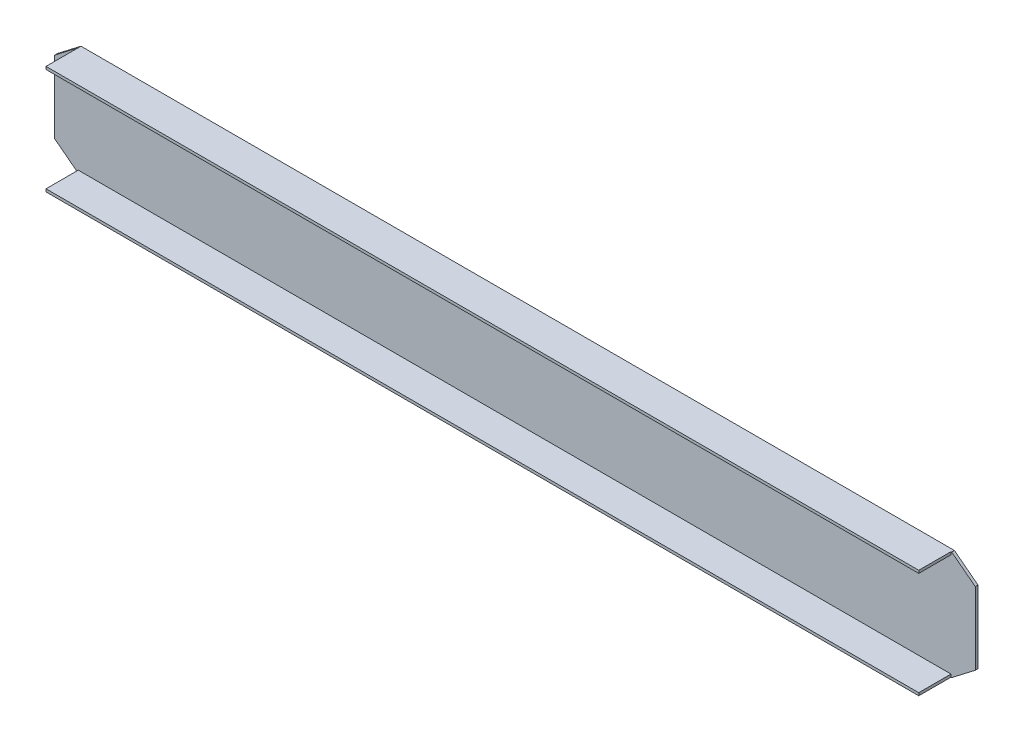
ISO-10303-21;
HEADER;
FILE_DESCRIPTION(('STEP AP214'),'2;1');
FILE_NAME('part.step','',(''),(''),'','','');
FILE_SCHEMA(('AUTOMOTIVE_DESIGN { 1 0 10303 214 1 1 1 1 }'));
ENDSEC;
DATA;
#1=APPLICATION_CONTEXT('core data for automotive mechanical design processes');
#2=APPLICATION_PROTOCOL_DEFINITION('international standard','automotive_design',2000,#1);
#3=PRODUCT_CONTEXT('',#1,'mechanical');
#4=PRODUCT('Part','Part','',(#3));
#5=PRODUCT_RELATED_PRODUCT_CATEGORY('part','',(#4));
#6=PRODUCT_DEFINITION_FORMATION('','',#4);
#7=PRODUCT_DEFINITION_CONTEXT('part definition',#1,'design');
#8=PRODUCT_DEFINITION('design','',#6,#7);
#9=PRODUCT_DEFINITION_SHAPE('','',#8);
#10=(LENGTH_UNIT() NAMED_UNIT(*) SI_UNIT(.MILLI.,.METRE.));
#11=(NAMED_UNIT(*) PLANE_ANGLE_UNIT() SI_UNIT($,.RADIAN.));
#12=(NAMED_UNIT(*) SI_UNIT($,.STERADIAN.) SOLID_ANGLE_UNIT());
#13=UNCERTAINTY_MEASURE_WITH_UNIT(LENGTH_MEASURE(1.E-05),#10,'distance_accuracy_value','');
#14=(GEOMETRIC_REPRESENTATION_CONTEXT(3) GLOBAL_UNCERTAINTY_ASSIGNED_CONTEXT((#13)) GLOBAL_UNIT_ASSIGNED_CONTEXT((#10,
#11,#12)) REPRESENTATION_CONTEXT('',''));
#15=CARTESIAN_POINT('',(0.,0.,0.));
#16=DIRECTION('',(0.,0.,1.));
#17=DIRECTION('',(1.,0.,0.));
#18=AXIS2_PLACEMENT_3D('',#15,#16,#17);
#19=CARTESIAN_POINT('',(0.,-926.923076923078,-7.5));
#20=DIRECTION('',(0.,0.,-1.));
#21=DIRECTION('',(-1.,0.,0.));
#22=AXIS2_PLACEMENT_3D('',#19,#20,#21);
#23=PLANE('',#22);
#24=DIRECTION('',(0.,-1.,0.));
#25=VECTOR('',#24,1.);
#26=CARTESIAN_POINT('',(-140.,270.,-7.5));
#27=LINE('',#26,#25);
#28=CARTESIAN_POINT('',(-140.,270.,-7.5));
#29=VERTEX_POINT('',#28);
#30=CARTESIAN_POINT('',(-140.,30.,-7.5));
#31=VERTEX_POINT('',#30);
#32=EDGE_CURVE('E265',#29,#31,#27,.T.);
#33=ORIENTED_EDGE('',*,*,#32,.F.);
#34=DIRECTION('',(1.,0.,0.));
#35=VECTOR('',#34,1.);
#36=CARTESIAN_POINT('',(-220.,270.,-7.5));
#37=LINE('',#36,#35);
#38=CARTESIAN_POINT('',(-220.,270.,-7.5));
#39=VERTEX_POINT('',#38);
#40=EDGE_CURVE('E262',#39,#29,#37,.T.);
#41=ORIENTED_EDGE('',*,*,#40,.F.);
#42=DIRECTION('',(0.,1.,0.));
#43=VECTOR('',#42,1.);
#44=CARTESIAN_POINT('',(-220.,270.,-7.5));
#45=LINE('',#44,#43);
#46=CARTESIAN_POINT('',(-220.,30.,-7.5));
#47=VERTEX_POINT('',#46);
#48=EDGE_CURVE('E274',#47,#39,#45,.T.);
#49=ORIENTED_EDGE('',*,*,#48,.F.);
#50=DIRECTION('',(-1.,0.,0.));
#51=VECTOR('',#50,1.);
#52=CARTESIAN_POINT('',(-220.,30.,-7.5));
#53=LINE('',#52,#51);
#54=EDGE_CURVE('E282',#31,#47,#53,.T.);
#55=ORIENTED_EDGE('',*,*,#54,.F.);
#56=EDGE_LOOP('',(#33,#41,#49,#55));
#57=FACE_BOUND('',#56,.T.);
#58=DIRECTION('',(-1.,0.,0.));
#59=VECTOR('',#58,1.);
#60=CARTESIAN_POINT('',(620.,30.,-7.5));
#61=LINE('',#60,#59);
#62=CARTESIAN_POINT('',(620.,30.,-7.5));
#63=VERTEX_POINT('',#62);
#64=CARTESIAN_POINT('',(540.,30.,-7.5));
#65=VERTEX_POINT('',#64);
#66=EDGE_CURVE('E336',#63,#65,#61,.T.);
#67=ORIENTED_EDGE('',*,*,#66,.F.);
#68=DIRECTION('',(0.,-1.,0.));
#69=VECTOR('',#68,1.);
#70=CARTESIAN_POINT('',(620.,270.,-7.5));
#71=LINE('',#70,#69);
#72=CARTESIAN_POINT('',(620.,270.,-7.5));
#73=VERTEX_POINT('',#72);
#74=EDGE_CURVE('E322',#73,#63,#71,.T.);
#75=ORIENTED_EDGE('',*,*,#74,.F.);
#76=DIRECTION('',(1.,0.,0.));
#77=VECTOR('',#76,1.);
#78=CARTESIAN_POINT('',(620.,270.,-7.5));
#79=LINE('',#78,#77);
#80=CARTESIAN_POINT('',(540.,270.,-7.5));
#81=VERTEX_POINT('',#80);
#82=EDGE_CURVE('E327',#81,#73,#79,.T.);
#83=ORIENTED_EDGE('',*,*,#82,.F.);
#84=DIRECTION('',(0.,1.,0.));
#85=VECTOR('',#84,1.);
#86=CARTESIAN_POINT('',(540.,270.,-7.5));
#87=LINE('',#86,#85);
#88=EDGE_CURVE('E338',#65,#81,#87,.T.);
#89=ORIENTED_EDGE('',*,*,#88,.F.);
#90=EDGE_LOOP('',(#67,#75,#83,#89));
#91=FACE_BOUND('',#90,.T.);
#92=DIRECTION('',(0.7926239891046,-0.609710760849693,0.));
#93=VECTOR('',#92,1.);
#94=CARTESIAN_POINT('',(-1270.,50.,-7.5));
#95=LINE('',#94,#93);
#96=CARTESIAN_POINT('',(-1270.,50.,-7.5));
#97=VERTEX_POINT('',#96);
#98=CARTESIAN_POINT('',(-1205.,0.,-7.5));
#99=VERTEX_POINT('',#98);
#100=EDGE_CURVE('E442',#97,#99,#95,.T.);
#101=ORIENTED_EDGE('',*,*,#100,.F.);
#102=DIRECTION('',(0.,-1.,0.));
#103=VECTOR('',#102,1.);
#104=CARTESIAN_POINT('',(-1270.,50.,-7.5));
#105=LINE('',#104,#103);
#106=CARTESIAN_POINT('',(-1270.,250.,-7.5));
#107=VERTEX_POINT('',#106);
#108=EDGE_CURVE('E457',#107,#97,#105,.T.);
#109=ORIENTED_EDGE('',*,*,#108,.F.);
#110=DIRECTION('',(-0.7926239891046,-0.609710760849693,0.));
#111=VECTOR('',#110,1.);
#112=CARTESIAN_POINT('',(-1270.,250.,-7.5));
#113=LINE('',#112,#111);
#114=CARTESIAN_POINT('',(-1205.,300.,-7.5));
#115=VERTEX_POINT('',#114);
#116=EDGE_CURVE('E463',#115,#107,#113,.T.);
#117=ORIENTED_EDGE('',*,*,#116,.F.);
#118=DIRECTION('',(-1.,0.,0.));
#119=VECTOR('',#118,1.);
#120=CARTESIAN_POINT('',(-1205.,300.,-7.5));
#121=LINE('',#120,#119);
#122=CARTESIAN_POINT('',(1205.,300.,-7.5));
#123=VERTEX_POINT('',#122);
#124=EDGE_CURVE('E428',#123,#115,#121,.T.);
#125=ORIENTED_EDGE('',*,*,#124,.F.);
#126=DIRECTION('',(-0.7926239891046,0.609710760849693,0.));
#127=VECTOR('',#126,1.);
#128=CARTESIAN_POINT('',(1270.,250.,-7.5));
#129=LINE('',#128,#127);
#130=CARTESIAN_POINT('',(1270.,250.,-7.5));
#131=VERTEX_POINT('',#130);
#132=EDGE_CURVE('E488',#131,#123,#129,.T.);
#133=ORIENTED_EDGE('',*,*,#132,.F.);
#134=DIRECTION('',(0.,1.,0.));
#135=VECTOR('',#134,1.);
#136=CARTESIAN_POINT('',(1270.,50.,-7.5));
#137=LINE('',#136,#135);
#138=CARTESIAN_POINT('',(1270.,50.,-7.5));
#139=VERTEX_POINT('',#138);
#140=EDGE_CURVE('E494',#139,#131,#137,.T.);
#141=ORIENTED_EDGE('',*,*,#140,.F.);
#142=DIRECTION('',(0.7926239891046,0.609710760849693,0.));
#143=VECTOR('',#142,1.);
#144=CARTESIAN_POINT('',(1270.,50.,-7.5));
#145=LINE('',#144,#143);
#146=CARTESIAN_POINT('',(1205.,0.,-7.5));
#147=VERTEX_POINT('',#146);
#148=EDGE_CURVE('E498',#147,#139,#145,.T.);
#149=ORIENTED_EDGE('',*,*,#148,.F.);
#150=DIRECTION('',(1.,0.,0.));
#151=VECTOR('',#150,1.);
#152=CARTESIAN_POINT('',(-1205.,0.,-7.5));
#153=LINE('',#152,#151);
#154=EDGE_CURVE('E501',#99,#147,#153,.T.);
#155=ORIENTED_EDGE('',*,*,#154,.F.);
#156=EDGE_LOOP('',(#101,#109,#117,#125,#133,#141,#149,#155));
#157=FACE_BOUND('',#156,.T.);
#158=DIRECTION('',(-1.,0.,0.));
#159=VECTOR('',#158,1.);
#160=CARTESIAN_POINT('',(220.,30.,-7.5));
#161=LINE('',#160,#159);
#162=CARTESIAN_POINT('',(220.,30.,-7.5));
#163=VERTEX_POINT('',#162);
#164=CARTESIAN_POINT('',(140.,30.,-7.5));
#165=VERTEX_POINT('',#164);
#166=EDGE_CURVE('E307',#163,#165,#161,.T.);
#167=ORIENTED_EDGE('',*,*,#166,.F.);
#168=DIRECTION('',(0.,-1.,0.));
#169=VECTOR('',#168,1.);
#170=CARTESIAN_POINT('',(220.,270.,-7.5));
#171=LINE('',#170,#169);
#172=CARTESIAN_POINT('',(220.,270.,-7.5));
#173=VERTEX_POINT('',#172);
#174=EDGE_CURVE('E293',#173,#163,#171,.T.);
#175=ORIENTED_EDGE('',*,*,#174,.F.);
#176=DIRECTION('',(1.,0.,0.));
#177=VECTOR('',#176,1.);
#178=CARTESIAN_POINT('',(220.,270.,-7.5));
#179=LINE('',#178,#177);
#180=CARTESIAN_POINT('',(140.,270.,-7.5));
#181=VERTEX_POINT('',#180);
#182=EDGE_CURVE('E298',#181,#173,#179,.T.);
#183=ORIENTED_EDGE('',*,*,#182,.F.);
#184=DIRECTION('',(0.,1.,0.));
#185=VECTOR('',#184,1.);
#186=CARTESIAN_POINT('',(140.,270.,-7.5));
#187=LINE('',#186,#185);
#188=EDGE_CURVE('E309',#165,#181,#187,.T.);
#189=ORIENTED_EDGE('',*,*,#188,.F.);
#190=EDGE_LOOP('',(#167,#175,#183,#189));
#191=FACE_BOUND('',#190,.T.);
#192=DIRECTION('',(0.,-1.,0.));
#193=VECTOR('',#192,1.);
#194=CARTESIAN_POINT('',(-540.,270.,-7.5));
#195=LINE('',#194,#193);
#196=CARTESIAN_POINT('',(-540.,270.,-7.5));
#197=VERTEX_POINT('',#196);
#198=CARTESIAN_POINT('',(-540.,30.,-7.5));
#199=VERTEX_POINT('',#198);
#200=EDGE_CURVE('E889',#197,#199,#195,.T.);
#201=ORIENTED_EDGE('',*,*,#200,.F.);
#202=DIRECTION('',(1.,0.,0.));
#203=VECTOR('',#202,1.);
#204=CARTESIAN_POINT('',(-620.,270.,-7.5));
#205=LINE('',#204,#203);
#206=CARTESIAN_POINT('',(-620.,270.,-7.5));
#207=VERTEX_POINT('',#206);
#208=EDGE_CURVE('E260',#207,#197,#205,.T.);
#209=ORIENTED_EDGE('',*,*,#208,.F.);
#210=DIRECTION('',(0.,1.,0.));
#211=VECTOR('',#210,1.);
#212=CARTESIAN_POINT('',(-620.,270.,-7.5));
#213=LINE('',#212,#211);
#214=CARTESIAN_POINT('',(-620.,30.,-7.5));
#215=VERTEX_POINT('',#214);
#216=EDGE_CURVE('E256',#215,#207,#213,.T.);
#217=ORIENTED_EDGE('',*,*,#216,.F.);
#218=DIRECTION('',(-1.,0.,0.));
#219=VECTOR('',#218,1.);
#220=CARTESIAN_POINT('',(-620.,30.,-7.5));
#221=LINE('',#220,#219);
#222=EDGE_CURVE('E886',#199,#215,#221,.T.);
#223=ORIENTED_EDGE('',*,*,#222,.F.);
#224=EDGE_LOOP('',(#201,#209,#217,#223));
#225=FACE_BOUND('',#224,.T.);
#226=ADVANCED_FACE('F32',(#57,#91,#157,#191,#225),#23,.T.);
#227=CARTESIAN_POINT('',(0.,-926.923076923078,0.));
#228=DIRECTION('',(0.,0.,-1.));
#229=DIRECTION('',(-1.,0.,0.));
#230=AXIS2_PLACEMENT_3D('',#227,#228,#229);
#231=PLANE('',#230);
#232=DIRECTION('',(0.,1.,0.));
#233=VECTOR('',#232,1.);
#234=CARTESIAN_POINT('',(1203.04903416362,0.,0.));
#235=LINE('',#234,#233);
#236=CARTESIAN_POINT('',(1203.04903416362,0.,0.));
#237=VERTEX_POINT('',#236);
#238=CARTESIAN_POINT('',(1203.04903416362,7.49999999999995,0.));
#239=VERTEX_POINT('',#238);
#240=EDGE_CURVE('E351',#237,#239,#235,.T.);
#241=ORIENTED_EDGE('',*,*,#240,.F.);
#242=DIRECTION('',(1.,0.,0.));
#243=VECTOR('',#242,1.);
#244=CARTESIAN_POINT('',(-1205.,0.,0.));
#245=LINE('',#244,#243);
#246=CARTESIAN_POINT('',(1205.,0.,0.));
#247=VERTEX_POINT('',#246);
#248=EDGE_CURVE('E472',#237,#247,#245,.T.);
#249=ORIENTED_EDGE('',*,*,#248,.T.);
#250=DIRECTION('',(0.7926239891046,0.609710760849693,0.));
#251=VECTOR('',#250,1.);
#252=CARTESIAN_POINT('',(1270.,50.,0.));
#253=LINE('',#252,#251);
#254=CARTESIAN_POINT('',(1270.,50.,0.));
#255=VERTEX_POINT('',#254);
#256=EDGE_CURVE('E474',#247,#255,#253,.T.);
#257=ORIENTED_EDGE('',*,*,#256,.T.);
#258=DIRECTION('',(0.,1.,0.));
#259=VECTOR('',#258,1.);
#260=CARTESIAN_POINT('',(1270.,50.,0.));
#261=LINE('',#260,#259);
#262=CARTESIAN_POINT('',(1270.,250.,0.));
#263=VERTEX_POINT('',#262);
#264=EDGE_CURVE('E477',#255,#263,#261,.T.);
#265=ORIENTED_EDGE('',*,*,#264,.T.);
#266=DIRECTION('',(-0.7926239891046,0.609710760849693,0.));
#267=VECTOR('',#266,1.);
#268=CARTESIAN_POINT('',(1270.,250.,0.));
#269=LINE('',#268,#267);
#270=CARTESIAN_POINT('',(1205.,300.,0.));
#271=VERTEX_POINT('',#270);
#272=EDGE_CURVE('E444',#263,#271,#269,.T.);
#273=ORIENTED_EDGE('',*,*,#272,.T.);
#274=DIRECTION('',(-1.,0.,0.));
#275=VECTOR('',#274,1.);
#276=CARTESIAN_POINT('',(-1205.,300.,0.));
#277=LINE('',#276,#275);
#278=CARTESIAN_POINT('',(1203.04903416362,300.,0.));
#279=VERTEX_POINT('',#278);
#280=EDGE_CURVE('E404',#271,#279,#277,.T.);
#281=ORIENTED_EDGE('',*,*,#280,.T.);
#282=DIRECTION('',(0.,1.,0.));
#283=VECTOR('',#282,1.);
#284=CARTESIAN_POINT('',(1203.04903416362,300.,0.));
#285=LINE('',#284,#283);
#286=CARTESIAN_POINT('',(1203.04903416362,292.5,0.));
#287=VERTEX_POINT('',#286);
#288=EDGE_CURVE('E386',#287,#279,#285,.T.);
#289=ORIENTED_EDGE('',*,*,#288,.F.);
#290=DIRECTION('',(1.,0.,0.));
#291=VECTOR('',#290,1.);
#292=CARTESIAN_POINT('',(-1205.,292.5,0.));
#293=LINE('',#292,#291);
#294=CARTESIAN_POINT('',(-1205.,292.5,0.));
#295=VERTEX_POINT('',#294);
#296=EDGE_CURVE('E395',#295,#287,#293,.T.);
#297=ORIENTED_EDGE('',*,*,#296,.F.);
#298=DIRECTION('',(0.,-1.,0.));
#299=VECTOR('',#298,1.);
#300=CARTESIAN_POINT('',(-1205.,300.,0.));
#301=LINE('',#300,#299);
#302=CARTESIAN_POINT('',(-1205.,300.,0.));
#303=VERTEX_POINT('',#302);
#304=EDGE_CURVE('E381',#303,#295,#301,.T.);
#305=ORIENTED_EDGE('',*,*,#304,.F.);
#306=DIRECTION('',(-0.7926239891046,-0.609710760849693,0.));
#307=VECTOR('',#306,1.);
#308=CARTESIAN_POINT('',(-1270.,250.,0.));
#309=LINE('',#308,#307);
#310=CARTESIAN_POINT('',(-1270.,250.,0.));
#311=VERTEX_POINT('',#310);
#312=EDGE_CURVE('E435',#303,#311,#309,.T.);
#313=ORIENTED_EDGE('',*,*,#312,.T.);
#314=DIRECTION('',(0.,-1.,0.));
#315=VECTOR('',#314,1.);
#316=CARTESIAN_POINT('',(-1270.,50.,0.));
#317=LINE('',#316,#315);
#318=CARTESIAN_POINT('',(-1270.,50.,0.));
#319=VERTEX_POINT('',#318);
#320=EDGE_CURVE('E440',#311,#319,#317,.T.);
#321=ORIENTED_EDGE('',*,*,#320,.T.);
#322=DIRECTION('',(0.7926239891046,-0.609710760849693,0.));
#323=VECTOR('',#322,1.);
#324=CARTESIAN_POINT('',(-1270.,50.,0.));
#325=LINE('',#324,#323);
#326=CARTESIAN_POINT('',(-1205.,0.,0.));
#327=VERTEX_POINT('',#326);
#328=EDGE_CURVE('E470',#319,#327,#325,.T.);
#329=ORIENTED_EDGE('',*,*,#328,.T.);
#330=DIRECTION('',(0.,-1.,0.));
#331=VECTOR('',#330,1.);
#332=CARTESIAN_POINT('',(-1205.,0.,0.));
#333=LINE('',#332,#331);
#334=CARTESIAN_POINT('',(-1205.,7.49999999999995,0.));
#335=VERTEX_POINT('',#334);
#336=EDGE_CURVE('E356',#335,#327,#333,.T.);
#337=ORIENTED_EDGE('',*,*,#336,.F.);
#338=DIRECTION('',(-1.,0.,0.));
#339=VECTOR('',#338,1.);
#340=CARTESIAN_POINT('',(-1205.,7.49999999999995,0.));
#341=LINE('',#340,#339);
#342=EDGE_CURVE('E365',#239,#335,#341,.T.);
#343=ORIENTED_EDGE('',*,*,#342,.F.);
#344=EDGE_LOOP('',(#241,#249,#257,#265,#273,#281,#289,#297,#305,#313,#321,#329,#337,#343));
#345=FACE_BOUND('',#344,.T.);
#346=ADVANCED_FACE('F482',(#345),#231,.F.);
#347=CARTESIAN_POINT('',(-1270.,50.,-7.5));
#348=DIRECTION('',(-0.609710760849693,-0.7926239891046,0.));
#349=DIRECTION('',(0.7926239891046,-0.609710760849693,0.));
#350=AXIS2_PLACEMENT_3D('',#347,#348,#349);
#351=PLANE('',#350);
#352=ORIENTED_EDGE('',*,*,#328,.F.);
#353=DIRECTION('',(0.,0.,1.));
#354=VECTOR('',#353,1.);
#355=CARTESIAN_POINT('',(-1270.,50.,-7.5));
#356=LINE('',#355,#354);
#357=EDGE_CURVE('E11',#97,#319,#356,.T.);
#358=ORIENTED_EDGE('',*,*,#357,.F.);
#359=ORIENTED_EDGE('',*,*,#100,.T.);
#360=DIRECTION('',(0.,0.,1.));
#361=VECTOR('',#360,1.);
#362=CARTESIAN_POINT('',(-1205.,0.,-7.5));
#363=LINE('',#362,#361);
#364=EDGE_CURVE('E456',#99,#327,#363,.T.);
#365=ORIENTED_EDGE('',*,*,#364,.T.);
#366=EDGE_LOOP('',(#352,#358,#359,#365));
#367=FACE_BOUND('',#366,.T.);
#368=ADVANCED_FACE('F34',(#367),#351,.T.);
#369=CARTESIAN_POINT('',(-1270.,50.,-7.5));
#370=DIRECTION('',(-1.,0.,0.));
#371=DIRECTION('',(0.,0.,1.));
#372=AXIS2_PLACEMENT_3D('',#369,#370,#371);
#373=PLANE('',#372);
#374=ORIENTED_EDGE('',*,*,#320,.F.);
#375=DIRECTION('',(0.,0.,1.));
#376=VECTOR('',#375,1.);
#377=CARTESIAN_POINT('',(-1270.,250.,-7.5));
#378=LINE('',#377,#376);
#379=EDGE_CURVE('E41',#107,#311,#378,.T.);
#380=ORIENTED_EDGE('',*,*,#379,.F.);
#381=ORIENTED_EDGE('',*,*,#108,.T.);
#382=ORIENTED_EDGE('',*,*,#357,.T.);
#383=EDGE_LOOP('',(#374,#380,#381,#382));
#384=FACE_BOUND('',#383,.T.);
#385=ADVANCED_FACE('F534',(#384),#373,.T.);
#386=CARTESIAN_POINT('',(-1270.,250.,-7.5));
#387=DIRECTION('',(-0.609710760849693,0.7926239891046,0.));
#388=DIRECTION('',(-0.7926239891046,-0.609710760849693,0.));
#389=AXIS2_PLACEMENT_3D('',#386,#387,#388);
#390=PLANE('',#389);
#391=ORIENTED_EDGE('',*,*,#312,.F.);
#392=DIRECTION('',(0.,0.,1.));
#393=VECTOR('',#392,1.);
#394=CARTESIAN_POINT('',(-1205.,300.,-7.5));
#395=LINE('',#394,#393);
#396=EDGE_CURVE('E425',#115,#303,#395,.T.);
#397=ORIENTED_EDGE('',*,*,#396,.F.);
#398=ORIENTED_EDGE('',*,*,#116,.T.);
#399=ORIENTED_EDGE('',*,*,#379,.T.);
#400=EDGE_LOOP('',(#391,#397,#398,#399));
#401=FACE_BOUND('',#400,.T.);
#402=ADVANCED_FACE('F436',(#401),#390,.T.);
#403=CARTESIAN_POINT('',(-1205.,300.,-7.5));
#404=DIRECTION('',(0.,1.,0.));
#405=DIRECTION('',(0.,0.,1.));
#406=AXIS2_PLACEMENT_3D('',#403,#404,#405);
#407=PLANE('',#406);
#408=ORIENTED_EDGE('',*,*,#280,.F.);
#409=DIRECTION('',(0.,0.,1.));
#410=VECTOR('',#409,1.);
#411=CARTESIAN_POINT('',(1205.,300.,-7.5));
#412=LINE('',#411,#410);
#413=EDGE_CURVE('E432',#123,#271,#412,.T.);
#414=ORIENTED_EDGE('',*,*,#413,.F.);
#415=ORIENTED_EDGE('',*,*,#124,.T.);
#416=ORIENTED_EDGE('',*,*,#396,.T.);
#417=DIRECTION('',(0.,0.,-1.));
#418=VECTOR('',#417,1.);
#419=CARTESIAN_POINT('',(-1205.,300.,89.));
#420=LINE('',#419,#418);
#421=CARTESIAN_POINT('',(-1205.,300.,89.));
#422=VERTEX_POINT('',#421);
#423=EDGE_CURVE('E392',#422,#303,#420,.T.);
#424=ORIENTED_EDGE('',*,*,#423,.F.);
#425=DIRECTION('',(-1.,0.,0.));
#426=VECTOR('',#425,1.);
#427=CARTESIAN_POINT('',(-1205.,300.,89.));
#428=LINE('',#427,#426);
#429=CARTESIAN_POINT('',(1203.04903416362,300.,89.));
#430=VERTEX_POINT('',#429);
#431=EDGE_CURVE('E390',#430,#422,#428,.T.);
#432=ORIENTED_EDGE('',*,*,#431,.F.);
#433=DIRECTION('',(0.,0.,-1.));
#434=VECTOR('',#433,1.);
#435=CARTESIAN_POINT('',(1203.04903416362,300.,89.));
#436=LINE('',#435,#434);
#437=EDGE_CURVE('E407',#430,#279,#436,.T.);
#438=ORIENTED_EDGE('',*,*,#437,.T.);
#439=EDGE_LOOP('',(#408,#414,#415,#416,#424,#432,#438));
#440=FACE_BOUND('',#439,.T.);
#441=ADVANCED_FACE('F423',(#440),#407,.T.);
#442=CARTESIAN_POINT('',(1270.,250.,-7.5));
#443=DIRECTION('',(0.609710760849693,0.7926239891046,0.));
#444=DIRECTION('',(-0.7926239891046,0.609710760849693,0.));
#445=AXIS2_PLACEMENT_3D('',#442,#443,#444);
#446=PLANE('',#445);
#447=ORIENTED_EDGE('',*,*,#272,.F.);
#448=DIRECTION('',(0.,0.,1.));
#449=VECTOR('',#448,1.);
#450=CARTESIAN_POINT('',(1270.,250.,-7.5));
#451=LINE('',#450,#449);
#452=EDGE_CURVE('E450',#131,#263,#451,.T.);
#453=ORIENTED_EDGE('',*,*,#452,.F.);
#454=ORIENTED_EDGE('',*,*,#132,.T.);
#455=ORIENTED_EDGE('',*,*,#413,.T.);
#456=EDGE_LOOP('',(#447,#453,#454,#455));
#457=FACE_BOUND('',#456,.T.);
#458=ADVANCED_FACE('F485',(#457),#446,.T.);
#459=CARTESIAN_POINT('',(1270.,50.,-7.5));
#460=DIRECTION('',(1.,0.,0.));
#461=DIRECTION('',(0.,0.,-1.));
#462=AXIS2_PLACEMENT_3D('',#459,#460,#461);
#463=PLANE('',#462);
#464=ORIENTED_EDGE('',*,*,#264,.F.);
#465=DIRECTION('',(0.,0.,1.));
#466=VECTOR('',#465,1.);
#467=CARTESIAN_POINT('',(1270.,50.,-7.5));
#468=LINE('',#467,#466);
#469=EDGE_CURVE('E452',#139,#255,#468,.T.);
#470=ORIENTED_EDGE('',*,*,#469,.F.);
#471=ORIENTED_EDGE('',*,*,#140,.T.);
#472=ORIENTED_EDGE('',*,*,#452,.T.);
#473=EDGE_LOOP('',(#464,#470,#471,#472));
#474=FACE_BOUND('',#473,.T.);
#475=ADVANCED_FACE('F543',(#474),#463,.T.);
#476=CARTESIAN_POINT('',(1270.,50.,-7.5));
#477=DIRECTION('',(0.609710760849693,-0.7926239891046,0.));
#478=DIRECTION('',(0.7926239891046,0.609710760849693,0.));
#479=AXIS2_PLACEMENT_3D('',#476,#477,#478);
#480=PLANE('',#479);
#481=ORIENTED_EDGE('',*,*,#256,.F.);
#482=DIRECTION('',(0.,0.,1.));
#483=VECTOR('',#482,1.);
#484=CARTESIAN_POINT('',(1205.,0.,-7.5));
#485=LINE('',#484,#483);
#486=EDGE_CURVE('E454',#147,#247,#485,.T.);
#487=ORIENTED_EDGE('',*,*,#486,.F.);
#488=ORIENTED_EDGE('',*,*,#148,.T.);
#489=ORIENTED_EDGE('',*,*,#469,.T.);
#490=EDGE_LOOP('',(#481,#487,#488,#489));
#491=FACE_BOUND('',#490,.T.);
#492=ADVANCED_FACE('F546',(#491),#480,.T.);
#493=CARTESIAN_POINT('',(-1205.,0.,-7.5));
#494=DIRECTION('',(0.,-1.,0.));
#495=DIRECTION('',(0.,0.,-1.));
#496=AXIS2_PLACEMENT_3D('',#493,#494,#495);
#497=PLANE('',#496);
#498=ORIENTED_EDGE('',*,*,#248,.F.);
#499=DIRECTION('',(0.,0.,-1.));
#500=VECTOR('',#499,1.);
#501=CARTESIAN_POINT('',(1203.04903416362,0.,89.));
#502=LINE('',#501,#500);
#503=CARTESIAN_POINT('',(1203.04903416362,0.,89.));
#504=VERTEX_POINT('',#503);
#505=EDGE_CURVE('E378',#504,#237,#502,.T.);
#506=ORIENTED_EDGE('',*,*,#505,.F.);
#507=DIRECTION('',(1.,0.,0.));
#508=VECTOR('',#507,1.);
#509=CARTESIAN_POINT('',(-1205.,0.,89.));
#510=LINE('',#509,#508);
#511=CARTESIAN_POINT('',(-1205.,0.,89.));
#512=VERTEX_POINT('',#511);
#513=EDGE_CURVE('E352',#512,#504,#510,.T.);
#514=ORIENTED_EDGE('',*,*,#513,.F.);
#515=DIRECTION('',(0.,0.,-1.));
#516=VECTOR('',#515,1.);
#517=CARTESIAN_POINT('',(-1205.,0.,89.));
#518=LINE('',#517,#516);
#519=EDGE_CURVE('E362',#512,#327,#518,.T.);
#520=ORIENTED_EDGE('',*,*,#519,.T.);
#521=ORIENTED_EDGE('',*,*,#364,.F.);
#522=ORIENTED_EDGE('',*,*,#154,.T.);
#523=ORIENTED_EDGE('',*,*,#486,.T.);
#524=EDGE_LOOP('',(#498,#506,#514,#520,#521,#522,#523));
#525=FACE_BOUND('',#524,.T.);
#526=ADVANCED_FACE('F549',(#525),#497,.T.);
#527=CARTESIAN_POINT('',(-1205.,300.,89.));
#528=DIRECTION('',(1.,0.,0.));
#529=DIRECTION('',(0.,0.,-1.));
#530=AXIS2_PLACEMENT_3D('',#527,#528,#529);
#531=PLANE('',#530);
#532=ORIENTED_EDGE('',*,*,#304,.T.);
#533=DIRECTION('',(0.,0.,-1.));
#534=VECTOR('',#533,1.);
#535=CARTESIAN_POINT('',(-1205.,292.5,89.));
#536=LINE('',#535,#534);
#537=CARTESIAN_POINT('',(-1205.,292.5,89.));
#538=VERTEX_POINT('',#537);
#539=EDGE_CURVE('E415',#538,#295,#536,.T.);
#540=ORIENTED_EDGE('',*,*,#539,.F.);
#541=DIRECTION('',(0.,-1.,0.));
#542=VECTOR('',#541,1.);
#543=CARTESIAN_POINT('',(-1205.,300.,89.));
#544=LINE('',#543,#542);
#545=EDGE_CURVE('E382',#422,#538,#544,.T.);
#546=ORIENTED_EDGE('',*,*,#545,.F.);
#547=ORIENTED_EDGE('',*,*,#423,.T.);
#548=EDGE_LOOP('',(#532,#540,#546,#547));
#549=FACE_BOUND('',#548,.T.);
#550=ADVANCED_FACE('F420',(#549),#531,.F.);
#551=CARTESIAN_POINT('',(-1205.,292.5,89.));
#552=DIRECTION('',(0.,1.,0.));
#553=DIRECTION('',(0.,0.,1.));
#554=AXIS2_PLACEMENT_3D('',#551,#552,#553);
#555=PLANE('',#554);
#556=ORIENTED_EDGE('',*,*,#296,.T.);
#557=DIRECTION('',(0.,0.,-1.));
#558=VECTOR('',#557,1.);
#559=CARTESIAN_POINT('',(1203.04903416362,292.5,89.));
#560=LINE('',#559,#558);
#561=CARTESIAN_POINT('',(1203.04903416362,292.5,89.));
#562=VERTEX_POINT('',#561);
#563=EDGE_CURVE('E409',#562,#287,#560,.T.);
#564=ORIENTED_EDGE('',*,*,#563,.F.);
#565=DIRECTION('',(1.,0.,0.));
#566=VECTOR('',#565,1.);
#567=CARTESIAN_POINT('',(-1205.,292.5,89.));
#568=LINE('',#567,#566);
#569=EDGE_CURVE('E385',#538,#562,#568,.T.);
#570=ORIENTED_EDGE('',*,*,#569,.F.);
#571=ORIENTED_EDGE('',*,*,#539,.T.);
#572=EDGE_LOOP('',(#556,#564,#570,#571));
#573=FACE_BOUND('',#572,.T.);
#574=ADVANCED_FACE('F507',(#573),#555,.F.);
#575=CARTESIAN_POINT('',(1203.04903416362,300.,89.));
#576=DIRECTION('',(-1.,0.,0.));
#577=DIRECTION('',(0.,0.,1.));
#578=AXIS2_PLACEMENT_3D('',#575,#576,#577);
#579=PLANE('',#578);
#580=ORIENTED_EDGE('',*,*,#288,.T.);
#581=ORIENTED_EDGE('',*,*,#437,.F.);
#582=DIRECTION('',(0.,1.,0.));
#583=VECTOR('',#582,1.);
#584=CARTESIAN_POINT('',(1203.04903416362,300.,89.));
#585=LINE('',#584,#583);
#586=EDGE_CURVE('E388',#562,#430,#585,.T.);
#587=ORIENTED_EDGE('',*,*,#586,.F.);
#588=ORIENTED_EDGE('',*,*,#563,.T.);
#589=EDGE_LOOP('',(#580,#581,#587,#588));
#590=FACE_BOUND('',#589,.T.);
#591=ADVANCED_FACE('F513',(#590),#579,.F.);
#592=CARTESIAN_POINT('',(-1205.,292.5,89.));
#593=DIRECTION('',(0.,0.,1.));
#594=DIRECTION('',(1.,0.,0.));
#595=AXIS2_PLACEMENT_3D('',#592,#593,#594);
#596=PLANE('',#595);
#597=ORIENTED_EDGE('',*,*,#545,.T.);
#598=ORIENTED_EDGE('',*,*,#569,.T.);
#599=ORIENTED_EDGE('',*,*,#586,.T.);
#600=ORIENTED_EDGE('',*,*,#431,.T.);
#601=EDGE_LOOP('',(#597,#598,#599,#600));
#602=FACE_BOUND('',#601,.T.);
#603=ADVANCED_FACE('F511',(#602),#596,.T.);
#604=CARTESIAN_POINT('',(1203.04903416362,0.,89.));
#605=DIRECTION('',(-1.,0.,0.));
#606=DIRECTION('',(0.,0.,1.));
#607=AXIS2_PLACEMENT_3D('',#604,#605,#606);
#608=PLANE('',#607);
#609=ORIENTED_EDGE('',*,*,#240,.T.);
#610=DIRECTION('',(0.,0.,-1.));
#611=VECTOR('',#610,1.);
#612=CARTESIAN_POINT('',(1203.04903416362,7.49999999999995,89.));
#613=LINE('',#612,#611);
#614=CARTESIAN_POINT('',(1203.04903416362,7.49999999999995,89.));
#615=VERTEX_POINT('',#614);
#616=EDGE_CURVE('E375',#615,#239,#613,.T.);
#617=ORIENTED_EDGE('',*,*,#616,.F.);
#618=DIRECTION('',(0.,1.,0.));
#619=VECTOR('',#618,1.);
#620=CARTESIAN_POINT('',(1203.04903416362,0.,89.));
#621=LINE('',#620,#619);
#622=EDGE_CURVE('E355',#504,#615,#621,.T.);
#623=ORIENTED_EDGE('',*,*,#622,.F.);
#624=ORIENTED_EDGE('',*,*,#505,.T.);
#625=EDGE_LOOP('',(#609,#617,#623,#624));
#626=FACE_BOUND('',#625,.T.);
#627=ADVANCED_FACE('F520',(#626),#608,.F.);
#628=CARTESIAN_POINT('',(-1205.,7.49999999999995,89.));
#629=DIRECTION('',(0.,-1.,0.));
#630=DIRECTION('',(0.,0.,-1.));
#631=AXIS2_PLACEMENT_3D('',#628,#629,#630);
#632=PLANE('',#631);
#633=ORIENTED_EDGE('',*,*,#342,.T.);
#634=DIRECTION('',(0.,0.,-1.));
#635=VECTOR('',#634,1.);
#636=CARTESIAN_POINT('',(-1205.,7.49999999999995,89.));
#637=LINE('',#636,#635);
#638=CARTESIAN_POINT('',(-1205.,7.49999999999995,89.));
#639=VERTEX_POINT('',#638);
#640=EDGE_CURVE('E372',#639,#335,#637,.T.);
#641=ORIENTED_EDGE('',*,*,#640,.F.);
#642=DIRECTION('',(-1.,0.,0.));
#643=VECTOR('',#642,1.);
#644=CARTESIAN_POINT('',(-1205.,7.49999999999995,89.));
#645=LINE('',#644,#643);
#646=EDGE_CURVE('E358',#615,#639,#645,.T.);
#647=ORIENTED_EDGE('',*,*,#646,.F.);
#648=ORIENTED_EDGE('',*,*,#616,.T.);
#649=EDGE_LOOP('',(#633,#641,#647,#648));
#650=FACE_BOUND('',#649,.T.);
#651=ADVANCED_FACE('F571',(#650),#632,.F.);
#652=CARTESIAN_POINT('',(-1205.,0.,89.));
#653=DIRECTION('',(1.,0.,0.));
#654=DIRECTION('',(0.,0.,-1.));
#655=AXIS2_PLACEMENT_3D('',#652,#653,#654);
#656=PLANE('',#655);
#657=ORIENTED_EDGE('',*,*,#336,.T.);
#658=ORIENTED_EDGE('',*,*,#519,.F.);
#659=DIRECTION('',(0.,-1.,0.));
#660=VECTOR('',#659,1.);
#661=CARTESIAN_POINT('',(-1205.,0.,89.));
#662=LINE('',#661,#660);
#663=EDGE_CURVE('E360',#639,#512,#662,.T.);
#664=ORIENTED_EDGE('',*,*,#663,.F.);
#665=ORIENTED_EDGE('',*,*,#640,.T.);
#666=EDGE_LOOP('',(#657,#658,#664,#665));
#667=FACE_BOUND('',#666,.T.);
#668=ADVANCED_FACE('F568',(#667),#656,.F.);
#669=CARTESIAN_POINT('',(1203.04903416362,0.,89.));
#670=DIRECTION('',(0.,0.,1.));
#671=DIRECTION('',(1.,0.,0.));
#672=AXIS2_PLACEMENT_3D('',#669,#670,#671);
#673=PLANE('',#672);
#674=ORIENTED_EDGE('',*,*,#513,.T.);
#675=ORIENTED_EDGE('',*,*,#622,.T.);
#676=ORIENTED_EDGE('',*,*,#646,.T.);
#677=ORIENTED_EDGE('',*,*,#663,.T.);
#678=EDGE_LOOP('',(#674,#675,#676,#677));
#679=FACE_BOUND('',#678,.T.);
#680=ADVANCED_FACE('F563',(#679),#673,.T.);
#681=CARTESIAN_POINT('',(620.,270.,-23.5));
#682=DIRECTION('',(-1.,0.,0.));
#683=DIRECTION('',(0.,0.,1.));
#684=AXIS2_PLACEMENT_3D('',#681,#682,#683);
#685=PLANE('',#684);
#686=ORIENTED_EDGE('',*,*,#74,.T.);
#687=DIRECTION('',(0.,0.,1.));
#688=VECTOR('',#687,1.);
#689=CARTESIAN_POINT('',(620.,30.,-23.5));
#690=LINE('',#689,#688);
#691=CARTESIAN_POINT('',(620.,30.,-23.5));
#692=VERTEX_POINT('',#691);
#693=EDGE_CURVE('E349',#692,#63,#690,.T.);
#694=ORIENTED_EDGE('',*,*,#693,.F.);
#695=DIRECTION('',(0.,-1.,0.));
#696=VECTOR('',#695,1.);
#697=CARTESIAN_POINT('',(620.,270.,-23.5));
#698=LINE('',#697,#696);
#699=CARTESIAN_POINT('',(620.,270.,-23.5));
#700=VERTEX_POINT('',#699);
#701=EDGE_CURVE('E323',#700,#692,#698,.T.);
#702=ORIENTED_EDGE('',*,*,#701,.F.);
#703=DIRECTION('',(0.,0.,1.));
#704=VECTOR('',#703,1.);
#705=CARTESIAN_POINT('',(620.,270.,-23.5));
#706=LINE('',#705,#704);
#707=EDGE_CURVE('E333',#700,#73,#706,.T.);
#708=ORIENTED_EDGE('',*,*,#707,.T.);
#709=EDGE_LOOP('',(#686,#694,#702,#708));
#710=FACE_BOUND('',#709,.T.);
#711=ADVANCED_FACE('F583',(#710),#685,.F.);
#712=CARTESIAN_POINT('',(620.,30.,-23.5));
#713=DIRECTION('',(0.,1.,0.));
#714=DIRECTION('',(-1.,0.,0.));
#715=AXIS2_PLACEMENT_3D('',#712,#713,#714);
#716=PLANE('',#715);
#717=ORIENTED_EDGE('',*,*,#66,.T.);
#718=DIRECTION('',(0.,0.,1.));
#719=VECTOR('',#718,1.);
#720=CARTESIAN_POINT('',(540.,30.,-23.5));
#721=LINE('',#720,#719);
#722=CARTESIAN_POINT('',(540.,30.,-23.5));
#723=VERTEX_POINT('',#722);
#724=EDGE_CURVE('E346',#723,#65,#721,.T.);
#725=ORIENTED_EDGE('',*,*,#724,.F.);
#726=DIRECTION('',(-1.,0.,0.));
#727=VECTOR('',#726,1.);
#728=CARTESIAN_POINT('',(620.,30.,-23.5));
#729=LINE('',#728,#727);
#730=EDGE_CURVE('E326',#692,#723,#729,.T.);
#731=ORIENTED_EDGE('',*,*,#730,.F.);
#732=ORIENTED_EDGE('',*,*,#693,.T.);
#733=EDGE_LOOP('',(#717,#725,#731,#732));
#734=FACE_BOUND('',#733,.T.);
#735=ADVANCED_FACE('F586',(#734),#716,.F.);
#736=CARTESIAN_POINT('',(540.,270.,-23.5));
#737=DIRECTION('',(1.,0.,0.));
#738=DIRECTION('',(0.,1.,0.));
#739=AXIS2_PLACEMENT_3D('',#736,#737,#738);
#740=PLANE('',#739);
#741=ORIENTED_EDGE('',*,*,#88,.T.);
#742=DIRECTION('',(0.,0.,1.));
#743=VECTOR('',#742,1.);
#744=CARTESIAN_POINT('',(540.,270.,-23.5));
#745=LINE('',#744,#743);
#746=CARTESIAN_POINT('',(540.,270.,-23.5));
#747=VERTEX_POINT('',#746);
#748=EDGE_CURVE('E344',#747,#81,#745,.T.);
#749=ORIENTED_EDGE('',*,*,#748,.F.);
#750=DIRECTION('',(0.,1.,0.));
#751=VECTOR('',#750,1.);
#752=CARTESIAN_POINT('',(540.,270.,-23.5));
#753=LINE('',#752,#751);
#754=EDGE_CURVE('E329',#723,#747,#753,.T.);
#755=ORIENTED_EDGE('',*,*,#754,.F.);
#756=ORIENTED_EDGE('',*,*,#724,.T.);
#757=EDGE_LOOP('',(#741,#749,#755,#756));
#758=FACE_BOUND('',#757,.T.);
#759=ADVANCED_FACE('F590',(#758),#740,.F.);
#760=CARTESIAN_POINT('',(620.,270.,-23.5));
#761=DIRECTION('',(0.,-1.,0.));
#762=DIRECTION('',(0.,0.,-1.));
#763=AXIS2_PLACEMENT_3D('',#760,#761,#762);
#764=PLANE('',#763);
#765=ORIENTED_EDGE('',*,*,#82,.T.);
#766=ORIENTED_EDGE('',*,*,#707,.F.);
#767=DIRECTION('',(1.,0.,0.));
#768=VECTOR('',#767,1.);
#769=CARTESIAN_POINT('',(620.,270.,-23.5));
#770=LINE('',#769,#768);
#771=EDGE_CURVE('E331',#747,#700,#770,.T.);
#772=ORIENTED_EDGE('',*,*,#771,.F.);
#773=ORIENTED_EDGE('',*,*,#748,.T.);
#774=EDGE_LOOP('',(#765,#766,#772,#773));
#775=FACE_BOUND('',#774,.T.);
#776=ADVANCED_FACE('F594',(#775),#764,.F.);
#777=CARTESIAN_POINT('',(620.,270.,-23.5));
#778=DIRECTION('',(0.,0.,-1.));
#779=DIRECTION('',(-1.,0.,0.));
#780=AXIS2_PLACEMENT_3D('',#777,#778,#779);
#781=PLANE('',#780);
#782=ORIENTED_EDGE('',*,*,#701,.T.);
#783=ORIENTED_EDGE('',*,*,#730,.T.);
#784=ORIENTED_EDGE('',*,*,#754,.T.);
#785=ORIENTED_EDGE('',*,*,#771,.T.);
#786=EDGE_LOOP('',(#782,#783,#784,#785));
#787=FACE_BOUND('',#786,.T.);
#788=ADVANCED_FACE('F598',(#787),#781,.T.);
#789=CARTESIAN_POINT('',(220.,270.,-23.5));
#790=DIRECTION('',(-1.,0.,0.));
#791=DIRECTION('',(0.,-1.,0.));
#792=AXIS2_PLACEMENT_3D('',#789,#790,#791);
#793=PLANE('',#792);
#794=ORIENTED_EDGE('',*,*,#174,.T.);
#795=DIRECTION('',(0.,0.,1.));
#796=VECTOR('',#795,1.);
#797=CARTESIAN_POINT('',(220.,30.,-23.5));
#798=LINE('',#797,#796);
#799=CARTESIAN_POINT('',(220.,30.,-23.5));
#800=VERTEX_POINT('',#799);
#801=EDGE_CURVE('E320',#800,#163,#798,.T.);
#802=ORIENTED_EDGE('',*,*,#801,.F.);
#803=DIRECTION('',(0.,-1.,0.));
#804=VECTOR('',#803,1.);
#805=CARTESIAN_POINT('',(220.,270.,-23.5));
#806=LINE('',#805,#804);
#807=CARTESIAN_POINT('',(220.,270.,-23.5));
#808=VERTEX_POINT('',#807);
#809=EDGE_CURVE('E294',#808,#800,#806,.T.);
#810=ORIENTED_EDGE('',*,*,#809,.F.);
#811=DIRECTION('',(0.,0.,1.));
#812=VECTOR('',#811,1.);
#813=CARTESIAN_POINT('',(220.,270.,-23.5));
#814=LINE('',#813,#812);
#815=EDGE_CURVE('E304',#808,#173,#814,.T.);
#816=ORIENTED_EDGE('',*,*,#815,.T.);
#817=EDGE_LOOP('',(#794,#802,#810,#816));
#818=FACE_BOUND('',#817,.T.);
#819=ADVANCED_FACE('F602',(#818),#793,.F.);
#820=CARTESIAN_POINT('',(220.,30.,-23.5));
#821=DIRECTION('',(0.,1.,0.));
#822=DIRECTION('',(-1.,0.,0.));
#823=AXIS2_PLACEMENT_3D('',#820,#821,#822);
#824=PLANE('',#823);
#825=ORIENTED_EDGE('',*,*,#166,.T.);
#826=DIRECTION('',(0.,0.,1.));
#827=VECTOR('',#826,1.);
#828=CARTESIAN_POINT('',(140.,30.,-23.5));
#829=LINE('',#828,#827);
#830=CARTESIAN_POINT('',(140.,30.,-23.5));
#831=VERTEX_POINT('',#830);
#832=EDGE_CURVE('E317',#831,#165,#829,.T.);
#833=ORIENTED_EDGE('',*,*,#832,.F.);
#834=DIRECTION('',(-1.,0.,0.));
#835=VECTOR('',#834,1.);
#836=CARTESIAN_POINT('',(220.,30.,-23.5));
#837=LINE('',#836,#835);
#838=EDGE_CURVE('E297',#800,#831,#837,.T.);
#839=ORIENTED_EDGE('',*,*,#838,.F.);
#840=ORIENTED_EDGE('',*,*,#801,.T.);
#841=EDGE_LOOP('',(#825,#833,#839,#840));
#842=FACE_BOUND('',#841,.T.);
#843=ADVANCED_FACE('F606',(#842),#824,.F.);
#844=CARTESIAN_POINT('',(140.,270.,-23.5));
#845=DIRECTION('',(1.,0.,0.));
#846=DIRECTION('',(0.,0.,-1.));
#847=AXIS2_PLACEMENT_3D('',#844,#845,#846);
#848=PLANE('',#847);
#849=ORIENTED_EDGE('',*,*,#188,.T.);
#850=DIRECTION('',(0.,0.,1.));
#851=VECTOR('',#850,1.);
#852=CARTESIAN_POINT('',(140.,270.,-23.5));
#853=LINE('',#852,#851);
#854=CARTESIAN_POINT('',(140.,270.,-23.5));
#855=VERTEX_POINT('',#854);
#856=EDGE_CURVE('E315',#855,#181,#853,.T.);
#857=ORIENTED_EDGE('',*,*,#856,.F.);
#858=DIRECTION('',(0.,1.,0.));
#859=VECTOR('',#858,1.);
#860=CARTESIAN_POINT('',(140.,270.,-23.5));
#861=LINE('',#860,#859);
#862=EDGE_CURVE('E300',#831,#855,#861,.T.);
#863=ORIENTED_EDGE('',*,*,#862,.F.);
#864=ORIENTED_EDGE('',*,*,#832,.T.);
#865=EDGE_LOOP('',(#849,#857,#863,#864));
#866=FACE_BOUND('',#865,.T.);
#867=ADVANCED_FACE('F610',(#866),#848,.F.);
#868=CARTESIAN_POINT('',(220.,270.,-23.5));
#869=DIRECTION('',(0.,-1.,0.));
#870=DIRECTION('',(0.,0.,-1.));
#871=AXIS2_PLACEMENT_3D('',#868,#869,#870);
#872=PLANE('',#871);
#873=ORIENTED_EDGE('',*,*,#182,.T.);
#874=ORIENTED_EDGE('',*,*,#815,.F.);
#875=DIRECTION('',(1.,0.,0.));
#876=VECTOR('',#875,1.);
#877=CARTESIAN_POINT('',(220.,270.,-23.5));
#878=LINE('',#877,#876);
#879=EDGE_CURVE('E302',#855,#808,#878,.T.);
#880=ORIENTED_EDGE('',*,*,#879,.F.);
#881=ORIENTED_EDGE('',*,*,#856,.T.);
#882=EDGE_LOOP('',(#873,#874,#880,#881));
#883=FACE_BOUND('',#882,.T.);
#884=ADVANCED_FACE('F614',(#883),#872,.F.);
#885=CARTESIAN_POINT('',(220.,30.,-23.5));
#886=DIRECTION('',(0.,0.,-1.));
#887=DIRECTION('',(-1.,0.,0.));
#888=AXIS2_PLACEMENT_3D('',#885,#886,#887);
#889=PLANE('',#888);
#890=ORIENTED_EDGE('',*,*,#809,.T.);
#891=ORIENTED_EDGE('',*,*,#838,.T.);
#892=ORIENTED_EDGE('',*,*,#862,.T.);
#893=ORIENTED_EDGE('',*,*,#879,.T.);
#894=EDGE_LOOP('',(#890,#891,#892,#893));
#895=FACE_BOUND('',#894,.T.);
#896=ADVANCED_FACE('F618',(#895),#889,.T.);
#897=CARTESIAN_POINT('',(-220.,270.,-23.5));
#898=DIRECTION('',(0.,-1.,0.));
#899=DIRECTION('',(0.,0.,-1.));
#900=AXIS2_PLACEMENT_3D('',#897,#898,#899);
#901=PLANE('',#900);
#902=ORIENTED_EDGE('',*,*,#40,.T.);
#903=DIRECTION('',(0.,0.,1.));
#904=VECTOR('',#903,1.);
#905=CARTESIAN_POINT('',(-140.,270.,-23.5));
#906=LINE('',#905,#904);
#907=CARTESIAN_POINT('',(-140.,270.,-23.5));
#908=VERTEX_POINT('',#907);
#909=EDGE_CURVE('E291',#908,#29,#906,.T.);
#910=ORIENTED_EDGE('',*,*,#909,.F.);
#911=DIRECTION('',(1.,0.,0.));
#912=VECTOR('',#911,1.);
#913=CARTESIAN_POINT('',(-220.,270.,-23.5));
#914=LINE('',#913,#912);
#915=CARTESIAN_POINT('',(-220.,270.,-23.5));
#916=VERTEX_POINT('',#915);
#917=EDGE_CURVE('E270',#916,#908,#914,.T.);
#918=ORIENTED_EDGE('',*,*,#917,.F.);
#919=DIRECTION('',(0.,0.,1.));
#920=VECTOR('',#919,1.);
#921=CARTESIAN_POINT('',(-220.,270.,-23.5));
#922=LINE('',#921,#920);
#923=EDGE_CURVE('E279',#916,#39,#922,.T.);
#924=ORIENTED_EDGE('',*,*,#923,.T.);
#925=EDGE_LOOP('',(#902,#910,#918,#924));
#926=FACE_BOUND('',#925,.T.);
#927=ADVANCED_FACE('F622',(#926),#901,.F.);
#928=CARTESIAN_POINT('',(-140.,270.,-23.5));
#929=DIRECTION('',(-1.,0.,0.));
#930=DIRECTION('',(0.,0.,1.));
#931=AXIS2_PLACEMENT_3D('',#928,#929,#930);
#932=PLANE('',#931);
#933=ORIENTED_EDGE('',*,*,#32,.T.);
#934=DIRECTION('',(0.,0.,1.));
#935=VECTOR('',#934,1.);
#936=CARTESIAN_POINT('',(-140.,30.,-23.5));
#937=LINE('',#936,#935);
#938=CARTESIAN_POINT('',(-140.,30.,-23.5));
#939=VERTEX_POINT('',#938);
#940=EDGE_CURVE('E288',#939,#31,#937,.T.);
#941=ORIENTED_EDGE('',*,*,#940,.F.);
#942=DIRECTION('',(0.,-1.,0.));
#943=VECTOR('',#942,1.);
#944=CARTESIAN_POINT('',(-140.,270.,-23.5));
#945=LINE('',#944,#943);
#946=EDGE_CURVE('E273',#908,#939,#945,.T.);
#947=ORIENTED_EDGE('',*,*,#946,.F.);
#948=ORIENTED_EDGE('',*,*,#909,.T.);
#949=EDGE_LOOP('',(#933,#941,#947,#948));
#950=FACE_BOUND('',#949,.T.);
#951=ADVANCED_FACE('F626',(#950),#932,.F.);
#952=CARTESIAN_POINT('',(-220.,30.,-23.5));
#953=DIRECTION('',(0.,1.,0.));
#954=DIRECTION('',(-1.,0.,0.));
#955=AXIS2_PLACEMENT_3D('',#952,#953,#954);
#956=PLANE('',#955);
#957=ORIENTED_EDGE('',*,*,#54,.T.);
#958=DIRECTION('',(0.,0.,1.));
#959=VECTOR('',#958,1.);
#960=CARTESIAN_POINT('',(-220.,30.,-23.5));
#961=LINE('',#960,#959);
#962=CARTESIAN_POINT('',(-220.,30.,-23.5));
#963=VERTEX_POINT('',#962);
#964=EDGE_CURVE('E57',#963,#47,#961,.T.);
#965=ORIENTED_EDGE('',*,*,#964,.F.);
#966=DIRECTION('',(-1.,0.,0.));
#967=VECTOR('',#966,1.);
#968=CARTESIAN_POINT('',(-220.,30.,-23.5));
#969=LINE('',#968,#967);
#970=EDGE_CURVE('E276',#939,#963,#969,.T.);
#971=ORIENTED_EDGE('',*,*,#970,.F.);
#972=ORIENTED_EDGE('',*,*,#940,.T.);
#973=EDGE_LOOP('',(#957,#965,#971,#972));
#974=FACE_BOUND('',#973,.T.);
#975=ADVANCED_FACE('F630',(#974),#956,.F.);
#976=CARTESIAN_POINT('',(-220.,270.,-23.5));
#977=DIRECTION('',(1.,0.,0.));
#978=DIRECTION('',(0.,1.,0.));
#979=AXIS2_PLACEMENT_3D('',#976,#977,#978);
#980=PLANE('',#979);
#981=ORIENTED_EDGE('',*,*,#48,.T.);
#982=ORIENTED_EDGE('',*,*,#923,.F.);
#983=DIRECTION('',(0.,1.,0.));
#984=VECTOR('',#983,1.);
#985=CARTESIAN_POINT('',(-220.,270.,-23.5));
#986=LINE('',#985,#984);
#987=EDGE_CURVE('E278',#963,#916,#986,.T.);
#988=ORIENTED_EDGE('',*,*,#987,.F.);
#989=ORIENTED_EDGE('',*,*,#964,.T.);
#990=EDGE_LOOP('',(#981,#982,#988,#989));
#991=FACE_BOUND('',#990,.T.);
#992=ADVANCED_FACE('F634',(#991),#980,.F.);
#993=CARTESIAN_POINT('',(-140.,270.,-23.5));
#994=DIRECTION('',(0.,0.,-1.));
#995=DIRECTION('',(-1.,0.,0.));
#996=AXIS2_PLACEMENT_3D('',#993,#994,#995);
#997=PLANE('',#996);
#998=ORIENTED_EDGE('',*,*,#917,.T.);
#999=ORIENTED_EDGE('',*,*,#946,.T.);
#1000=ORIENTED_EDGE('',*,*,#970,.T.);
#1001=ORIENTED_EDGE('',*,*,#987,.T.);
#1002=EDGE_LOOP('',(#998,#999,#1000,#1001));
#1003=FACE_BOUND('',#1002,.T.);
#1004=ADVANCED_FACE('F638',(#1003),#997,.T.);
#1005=CARTESIAN_POINT('',(-620.,270.,-23.5));
#1006=DIRECTION('',(0.,-1.,0.));
#1007=DIRECTION('',(0.,0.,-1.));
#1008=AXIS2_PLACEMENT_3D('',#1005,#1006,#1007);
#1009=PLANE('',#1008);
#1010=ORIENTED_EDGE('',*,*,#208,.T.);
#1011=DIRECTION('',(0.,0.,1.));
#1012=VECTOR('',#1011,1.);
#1013=CARTESIAN_POINT('',(-540.,270.,-23.5));
#1014=LINE('',#1013,#1012);
#1015=CARTESIAN_POINT('',(-540.,270.,-23.5));
#1016=VERTEX_POINT('',#1015);
#1017=EDGE_CURVE('E241',#1016,#197,#1014,.T.);
#1018=ORIENTED_EDGE('',*,*,#1017,.F.);
#1019=DIRECTION('',(1.,0.,0.));
#1020=VECTOR('',#1019,1.);
#1021=CARTESIAN_POINT('',(-620.,270.,-23.5));
#1022=LINE('',#1021,#1020);
#1023=CARTESIAN_POINT('',(-620.,270.,-23.5));
#1024=VERTEX_POINT('',#1023);
#1025=EDGE_CURVE('E248',#1024,#1016,#1022,.T.);
#1026=ORIENTED_EDGE('',*,*,#1025,.F.);
#1027=DIRECTION('',(0.,0.,1.));
#1028=VECTOR('',#1027,1.);
#1029=CARTESIAN_POINT('',(-620.,270.,-23.5));
#1030=LINE('',#1029,#1028);
#1031=EDGE_CURVE('E883',#1024,#207,#1030,.T.);
#1032=ORIENTED_EDGE('',*,*,#1031,.T.);
#1033=EDGE_LOOP('',(#1010,#1018,#1026,#1032));
#1034=FACE_BOUND('',#1033,.T.);
#1035=ADVANCED_FACE('F258',(#1034),#1009,.F.);
#1036=CARTESIAN_POINT('',(-540.,270.,-23.5));
#1037=DIRECTION('',(-1.,0.,0.));
#1038=DIRECTION('',(0.,-1.,0.));
#1039=AXIS2_PLACEMENT_3D('',#1036,#1037,#1038);
#1040=PLANE('',#1039);
#1041=ORIENTED_EDGE('',*,*,#200,.T.);
#1042=DIRECTION('',(0.,0.,1.));
#1043=VECTOR('',#1042,1.);
#1044=CARTESIAN_POINT('',(-540.,30.,-23.5));
#1045=LINE('',#1044,#1043);
#1046=CARTESIAN_POINT('',(-540.,30.,-23.5));
#1047=VERTEX_POINT('',#1046);
#1048=EDGE_CURVE('E244',#1047,#199,#1045,.T.);
#1049=ORIENTED_EDGE('',*,*,#1048,.F.);
#1050=DIRECTION('',(0.,-1.,0.));
#1051=VECTOR('',#1050,1.);
#1052=CARTESIAN_POINT('',(-540.,270.,-23.5));
#1053=LINE('',#1052,#1051);
#1054=EDGE_CURVE('E237',#1016,#1047,#1053,.T.);
#1055=ORIENTED_EDGE('',*,*,#1054,.F.);
#1056=ORIENTED_EDGE('',*,*,#1017,.T.);
#1057=EDGE_LOOP('',(#1041,#1049,#1055,#1056));
#1058=FACE_BOUND('',#1057,.T.);
#1059=ADVANCED_FACE('F239',(#1058),#1040,.F.);
#1060=CARTESIAN_POINT('',(-620.,30.,-23.5));
#1061=DIRECTION('',(0.,1.,0.));
#1062=DIRECTION('',(-1.,0.,0.));
#1063=AXIS2_PLACEMENT_3D('',#1060,#1061,#1062);
#1064=PLANE('',#1063);
#1065=ORIENTED_EDGE('',*,*,#222,.T.);
#1066=DIRECTION('',(0.,0.,1.));
#1067=VECTOR('',#1066,1.);
#1068=CARTESIAN_POINT('',(-620.,30.,-23.5));
#1069=LINE('',#1068,#1067);
#1070=CARTESIAN_POINT('',(-620.,30.,-23.5));
#1071=VERTEX_POINT('',#1070);
#1072=EDGE_CURVE('E49',#1071,#215,#1069,.T.);
#1073=ORIENTED_EDGE('',*,*,#1072,.F.);
#1074=DIRECTION('',(-1.,0.,0.));
#1075=VECTOR('',#1074,1.);
#1076=CARTESIAN_POINT('',(-620.,30.,-23.5));
#1077=LINE('',#1076,#1075);
#1078=EDGE_CURVE('E247',#1047,#1071,#1077,.T.);
#1079=ORIENTED_EDGE('',*,*,#1078,.F.);
#1080=ORIENTED_EDGE('',*,*,#1048,.T.);
#1081=EDGE_LOOP('',(#1065,#1073,#1079,#1080));
#1082=FACE_BOUND('',#1081,.T.);
#1083=ADVANCED_FACE('F646',(#1082),#1064,.F.);
#1084=CARTESIAN_POINT('',(-620.,270.,-23.5));
#1085=DIRECTION('',(1.,0.,0.));
#1086=DIRECTION('',(0.,0.,-1.));
#1087=AXIS2_PLACEMENT_3D('',#1084,#1085,#1086);
#1088=PLANE('',#1087);
#1089=ORIENTED_EDGE('',*,*,#216,.T.);
#1090=ORIENTED_EDGE('',*,*,#1031,.F.);
#1091=DIRECTION('',(0.,1.,0.));
#1092=VECTOR('',#1091,1.);
#1093=CARTESIAN_POINT('',(-620.,270.,-23.5));
#1094=LINE('',#1093,#1092);
#1095=EDGE_CURVE('E252',#1071,#1024,#1094,.T.);
#1096=ORIENTED_EDGE('',*,*,#1095,.F.);
#1097=ORIENTED_EDGE('',*,*,#1072,.T.);
#1098=EDGE_LOOP('',(#1089,#1090,#1096,#1097));
#1099=FACE_BOUND('',#1098,.T.);
#1100=ADVANCED_FACE('F649',(#1099),#1088,.F.);
#1101=CARTESIAN_POINT('',(-620.,270.,-23.5));
#1102=DIRECTION('',(0.,0.,-1.));
#1103=DIRECTION('',(-1.,0.,0.));
#1104=AXIS2_PLACEMENT_3D('',#1101,#1102,#1103);
#1105=PLANE('',#1104);
#1106=ORIENTED_EDGE('',*,*,#1025,.T.);
#1107=ORIENTED_EDGE('',*,*,#1054,.T.);
#1108=ORIENTED_EDGE('',*,*,#1078,.T.);
#1109=ORIENTED_EDGE('',*,*,#1095,.T.);
#1110=EDGE_LOOP('',(#1106,#1107,#1108,#1109));
#1111=FACE_BOUND('',#1110,.T.);
#1112=ADVANCED_FACE('F251',(#1111),#1105,.T.);
#1113=CLOSED_SHELL('',(#226,#346,#368,#385,#402,#441,#458,#475,#492,#526,#550,#574,#591,#603,
#627,#651,#668,#680,#711,#735,#759,#776,#788,#819,#843,#867,#884,#896,#927,#951,#975,#992,#1004,
#1035,#1059,#1083,#1100,#1112));
#1114=MANIFOLD_SOLID_BREP('B2',#1113);
#1115=ADVANCED_BREP_SHAPE_REPRESENTATION('',(#18,#1114),#14);
#1116=SHAPE_DEFINITION_REPRESENTATION(#9,#1115);
ENDSEC;
END-ISO-10303-21;
